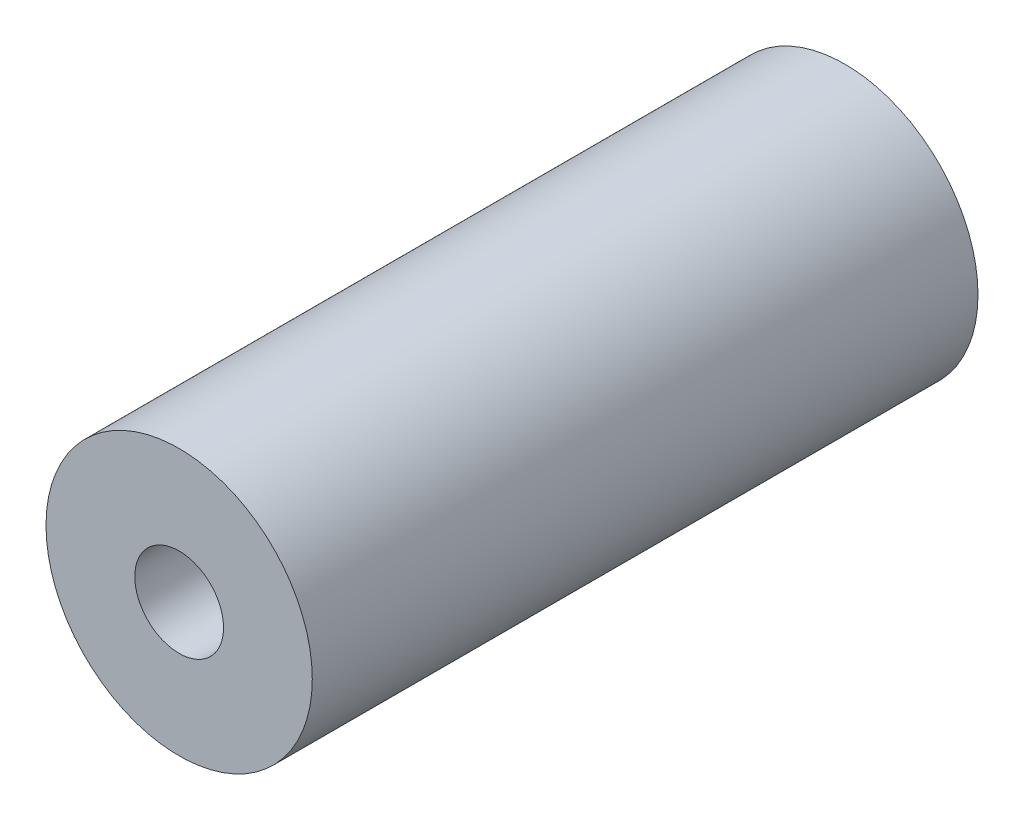
ISO-10303-21;
HEADER;
FILE_DESCRIPTION(('STEP AP214'),'2;1');
FILE_NAME('part.step','',(''),(''),'','','');
FILE_SCHEMA(('AUTOMOTIVE_DESIGN { 1 0 10303 214 1 1 1 1 }'));
ENDSEC;
DATA;
#1=APPLICATION_CONTEXT('core data for automotive mechanical design processes');
#2=APPLICATION_PROTOCOL_DEFINITION('international standard','automotive_design',2000,#1);
#3=PRODUCT_CONTEXT('',#1,'mechanical');
#4=PRODUCT('Part','Part','',(#3));
#5=PRODUCT_RELATED_PRODUCT_CATEGORY('part','',(#4));
#6=PRODUCT_DEFINITION_FORMATION('','',#4);
#7=PRODUCT_DEFINITION_CONTEXT('part definition',#1,'design');
#8=PRODUCT_DEFINITION('design','',#6,#7);
#9=PRODUCT_DEFINITION_SHAPE('','',#8);
#10=(LENGTH_UNIT() NAMED_UNIT(*) SI_UNIT(.MILLI.,.METRE.));
#11=(NAMED_UNIT(*) PLANE_ANGLE_UNIT() SI_UNIT($,.RADIAN.));
#12=(NAMED_UNIT(*) SI_UNIT($,.STERADIAN.) SOLID_ANGLE_UNIT());
#13=UNCERTAINTY_MEASURE_WITH_UNIT(LENGTH_MEASURE(1.E-05),#10,'distance_accuracy_value','');
#14=(GEOMETRIC_REPRESENTATION_CONTEXT(3) GLOBAL_UNCERTAINTY_ASSIGNED_CONTEXT((#13)) GLOBAL_UNIT_ASSIGNED_CONTEXT((#10,
#11,#12)) REPRESENTATION_CONTEXT('',''));
#15=CARTESIAN_POINT('',(0.,0.,0.));
#16=DIRECTION('',(0.,0.,1.));
#17=DIRECTION('',(1.,0.,0.));
#18=AXIS2_PLACEMENT_3D('',#15,#16,#17);
#19=CARTESIAN_POINT('',(0.,0.,0.));
#20=DIRECTION('',(0.,0.,1.));
#21=DIRECTION('',(1.,0.,0.));
#22=AXIS2_PLACEMENT_3D('',#19,#20,#21);
#23=CYLINDRICAL_SURFACE('',#22,0.2);
#24=DIRECTION('',(0.,0.,1.));
#25=VECTOR('',#24,1.);
#26=CARTESIAN_POINT('',(0.2,0.,0.));
#27=LINE('',#26,#25);
#28=CARTESIAN_POINT('',(0.2,0.,0.));
#29=VERTEX_POINT('',#28);
#30=CARTESIAN_POINT('',(0.2,0.,3.));
#31=VERTEX_POINT('',#30);
#32=EDGE_CURVE('E11',#29,#31,#27,.T.);
#33=ORIENTED_EDGE('',*,*,#32,.F.);
#34=CARTESIAN_POINT('',(0.,0.,0.));
#35=DIRECTION('',(0.,0.,1.));
#36=DIRECTION('',(1.,0.,0.));
#37=AXIS2_PLACEMENT_3D('',#34,#35,#36);
#38=CIRCLE('',#37,0.2);
#39=EDGE_CURVE('E25',#29,#29,#38,.T.);
#40=ORIENTED_EDGE('',*,*,#39,.F.);
#41=ORIENTED_EDGE('',*,*,#32,.T.);
#42=CARTESIAN_POINT('',(0.,0.,3.));
#43=DIRECTION('',(0.,0.,1.));
#44=DIRECTION('',(1.,0.,0.));
#45=AXIS2_PLACEMENT_3D('',#42,#43,#44);
#46=CIRCLE('',#45,0.2);
#47=EDGE_CURVE('E68',#31,#31,#46,.T.);
#48=ORIENTED_EDGE('',*,*,#47,.T.);
#49=EDGE_LOOP('',(#33,#40,#41,#48));
#50=FACE_BOUND('',#49,.T.);
#51=ADVANCED_FACE('F17',(#50),#23,.F.);
#52=CARTESIAN_POINT('',(0.,0.,0.));
#53=DIRECTION('',(0.,0.,1.));
#54=DIRECTION('',(1.,0.,0.));
#55=AXIS2_PLACEMENT_3D('',#52,#53,#54);
#56=PLANE('',#55);
#57=ORIENTED_EDGE('',*,*,#39,.T.);
#58=EDGE_LOOP('',(#57));
#59=FACE_BOUND('',#58,.T.);
#60=CARTESIAN_POINT('',(0.,0.,0.));
#61=DIRECTION('',(0.,0.,1.));
#62=DIRECTION('',(1.,0.,0.));
#63=AXIS2_PLACEMENT_3D('',#60,#61,#62);
#64=CIRCLE('',#63,0.6);
#65=CARTESIAN_POINT('',(0.6,0.,0.));
#66=VERTEX_POINT('',#65);
#67=EDGE_CURVE('E56',#66,#66,#64,.T.);
#68=ORIENTED_EDGE('',*,*,#67,.F.);
#69=EDGE_LOOP('',(#68));
#70=FACE_BOUND('',#69,.T.);
#71=ADVANCED_FACE('F75',(#59,#70),#56,.F.);
#72=CARTESIAN_POINT('',(0.,0.,3.));
#73=DIRECTION('',(0.,0.,1.));
#74=DIRECTION('',(1.,0.,0.));
#75=AXIS2_PLACEMENT_3D('',#72,#73,#74);
#76=PLANE('',#75);
#77=ORIENTED_EDGE('',*,*,#47,.F.);
#78=EDGE_LOOP('',(#77));
#79=FACE_BOUND('',#78,.T.);
#80=CARTESIAN_POINT('',(0.,0.,3.));
#81=DIRECTION('',(0.,0.,1.));
#82=DIRECTION('',(1.,0.,0.));
#83=AXIS2_PLACEMENT_3D('',#80,#81,#82);
#84=CIRCLE('',#83,0.6);
#85=CARTESIAN_POINT('',(0.6,0.,3.));
#86=VERTEX_POINT('',#85);
#87=EDGE_CURVE('E54',#86,#86,#84,.T.);
#88=ORIENTED_EDGE('',*,*,#87,.T.);
#89=EDGE_LOOP('',(#88));
#90=FACE_BOUND('',#89,.T.);
#91=ADVANCED_FACE('F60',(#79,#90),#76,.T.);
#92=CARTESIAN_POINT('',(0.,0.,0.));
#93=DIRECTION('',(0.,0.,1.));
#94=DIRECTION('',(1.,0.,0.));
#95=AXIS2_PLACEMENT_3D('',#92,#93,#94);
#96=CYLINDRICAL_SURFACE('',#95,0.6);
#97=ORIENTED_EDGE('',*,*,#87,.F.);
#98=DIRECTION('',(0.,0.,1.));
#99=VECTOR('',#98,1.);
#100=CARTESIAN_POINT('',(0.6,0.,0.));
#101=LINE('',#100,#99);
#102=EDGE_CURVE('E51',#66,#86,#101,.T.);
#103=ORIENTED_EDGE('',*,*,#102,.F.);
#104=ORIENTED_EDGE('',*,*,#67,.T.);
#105=ORIENTED_EDGE('',*,*,#102,.T.);
#106=EDGE_LOOP('',(#97,#103,#104,#105));
#107=FACE_BOUND('',#106,.T.);
#108=ADVANCED_FACE('F53',(#107),#96,.T.);
#109=CLOSED_SHELL('',(#51,#71,#91,#108));
#110=MANIFOLD_SOLID_BREP('B1',#109);
#111=ADVANCED_BREP_SHAPE_REPRESENTATION('',(#18,#110),#14);
#112=SHAPE_DEFINITION_REPRESENTATION(#9,#111);
ENDSEC;
END-ISO-10303-21;
